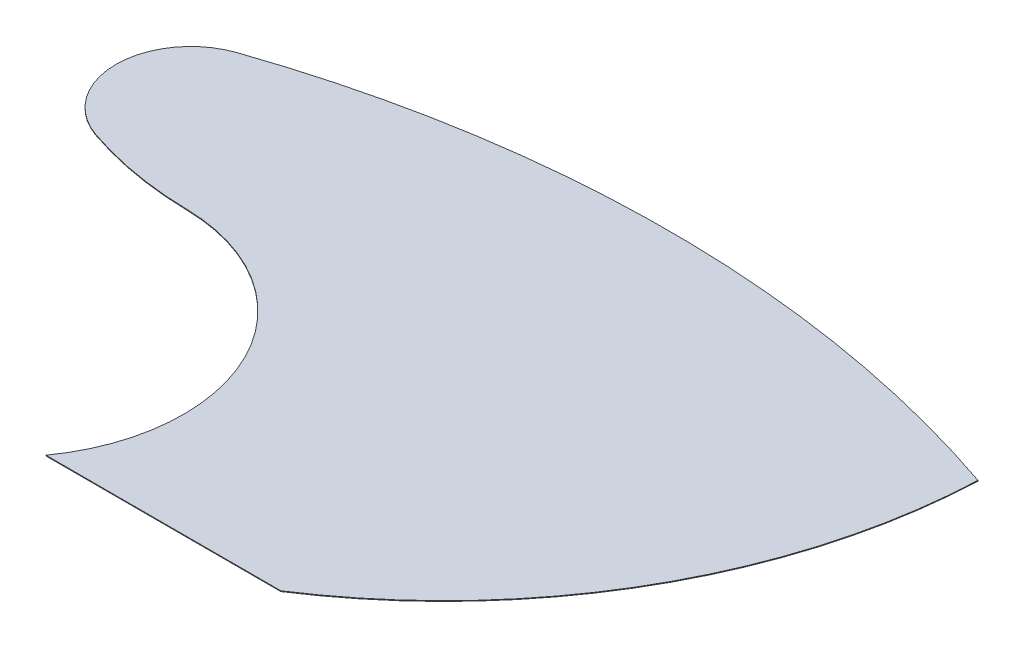
ISO-10303-21;
HEADER;
FILE_DESCRIPTION(('STEP AP214'),'2;1');
FILE_NAME('part.step','',(''),(''),'','','');
FILE_SCHEMA(('AUTOMOTIVE_DESIGN { 1 0 10303 214 1 1 1 1 }'));
ENDSEC;
DATA;
#1=APPLICATION_CONTEXT('core data for automotive mechanical design processes');
#2=APPLICATION_PROTOCOL_DEFINITION('international standard','automotive_design',2000,#1);
#3=PRODUCT_CONTEXT('',#1,'mechanical');
#4=PRODUCT('Part','Part','',(#3));
#5=PRODUCT_RELATED_PRODUCT_CATEGORY('part','',(#4));
#6=PRODUCT_DEFINITION_FORMATION('','',#4);
#7=PRODUCT_DEFINITION_CONTEXT('part definition',#1,'design');
#8=PRODUCT_DEFINITION('design','',#6,#7);
#9=PRODUCT_DEFINITION_SHAPE('','',#8);
#10=(LENGTH_UNIT() NAMED_UNIT(*) SI_UNIT(.MILLI.,.METRE.));
#11=(NAMED_UNIT(*) PLANE_ANGLE_UNIT() SI_UNIT($,.RADIAN.));
#12=(NAMED_UNIT(*) SI_UNIT($,.STERADIAN.) SOLID_ANGLE_UNIT());
#13=UNCERTAINTY_MEASURE_WITH_UNIT(LENGTH_MEASURE(1.E-05),#10,'distance_accuracy_value','');
#14=(GEOMETRIC_REPRESENTATION_CONTEXT(3) GLOBAL_UNCERTAINTY_ASSIGNED_CONTEXT((#13)) GLOBAL_UNIT_ASSIGNED_CONTEXT((#10,
#11,#12)) REPRESENTATION_CONTEXT('',''));
#15=CARTESIAN_POINT('',(0.,0.,0.));
#16=DIRECTION('',(0.,0.,1.));
#17=DIRECTION('',(1.,0.,0.));
#18=AXIS2_PLACEMENT_3D('',#15,#16,#17);
#19=CARTESIAN_POINT('',(36.6950206360601,0.2,-35.8213664681786));
#20=DIRECTION('',(0.,-1.,0.));
#21=DIRECTION('',(0.,0.,-1.));
#22=AXIS2_PLACEMENT_3D('',#19,#20,#21);
#23=CYLINDRICAL_SURFACE('',#22,49.58);
#24=CARTESIAN_POINT('',(36.6950206360601,0.,-35.8213664681786));
#25=DIRECTION('',(0.,-1.,0.));
#26=DIRECTION('',(0.,0.,1.));
#27=AXIS2_PLACEMENT_3D('',#24,#25,#26);
#28=CIRCLE('',#27,49.58);
#29=CARTESIAN_POINT('',(37.5541810671988,0.,-85.3939218123766));
#30=VERTEX_POINT('',#29);
#31=CARTESIAN_POINT('',(77.0118111562556,0.,-6.96425638850026));
#32=VERTEX_POINT('',#31);
#33=EDGE_CURVE('E117',#30,#32,#28,.T.);
#34=ORIENTED_EDGE('',*,*,#33,.T.);
#35=DIRECTION('',(0.,-1.,0.));
#36=VECTOR('',#35,1.);
#37=CARTESIAN_POINT('',(77.0118111562556,0.2,-6.96425638850026));
#38=LINE('',#37,#36);
#39=CARTESIAN_POINT('',(77.0118111562556,0.2,-6.96425638850026));
#40=VERTEX_POINT('',#39);
#41=EDGE_CURVE('E11',#40,#32,#38,.T.);
#42=ORIENTED_EDGE('',*,*,#41,.F.);
#43=CARTESIAN_POINT('',(36.6950206360601,0.2,-35.8213664681786));
#44=DIRECTION('',(0.,-1.,0.));
#45=DIRECTION('',(0.,0.,1.));
#46=AXIS2_PLACEMENT_3D('',#43,#44,#45);
#47=CIRCLE('',#46,49.58);
#48=CARTESIAN_POINT('',(37.5541810671988,0.2,-85.3939218123766));
#49=VERTEX_POINT('',#48);
#50=EDGE_CURVE('E127',#49,#40,#47,.T.);
#51=ORIENTED_EDGE('',*,*,#50,.F.);
#52=DIRECTION('',(0.,-1.,0.));
#53=VECTOR('',#52,1.);
#54=CARTESIAN_POINT('',(37.5541810671988,0.2,-85.3939218123766));
#55=LINE('',#54,#53);
#56=EDGE_CURVE('E113',#49,#30,#55,.T.);
#57=ORIENTED_EDGE('',*,*,#56,.T.);
#58=EDGE_LOOP('',(#34,#42,#51,#57));
#59=FACE_BOUND('',#58,.T.);
#60=ADVANCED_FACE('F33',(#59),#23,.F.);
#61=CARTESIAN_POINT('',(77.0118111562556,0.2,-6.96425638850026));
#62=DIRECTION('',(0.,0.,-1.));
#63=DIRECTION('',(-1.,0.,0.));
#64=AXIS2_PLACEMENT_3D('',#61,#62,#63);
#65=PLANE('',#64);
#66=DIRECTION('',(1.,0.,0.));
#67=VECTOR('',#66,1.);
#68=CARTESIAN_POINT('',(77.0118111562556,0.,-6.96425638850026));
#69=LINE('',#68,#67);
#70=CARTESIAN_POINT('',(142.011811156256,0.,-6.96425638850026));
#71=VERTEX_POINT('',#70);
#72=EDGE_CURVE('E120',#32,#71,#69,.T.);
#73=ORIENTED_EDGE('',*,*,#72,.T.);
#74=DIRECTION('',(0.,-1.,0.));
#75=VECTOR('',#74,1.);
#76=CARTESIAN_POINT('',(142.011811156256,0.2,-6.96425638850026));
#77=LINE('',#76,#75);
#78=CARTESIAN_POINT('',(142.011811156256,0.2,-6.96425638850026));
#79=VERTEX_POINT('',#78);
#80=EDGE_CURVE('E41',#79,#71,#77,.T.);
#81=ORIENTED_EDGE('',*,*,#80,.F.);
#82=DIRECTION('',(1.,0.,0.));
#83=VECTOR('',#82,1.);
#84=CARTESIAN_POINT('',(77.0118111562556,0.2,-6.96425638850026));
#85=LINE('',#84,#83);
#86=EDGE_CURVE('E86',#40,#79,#85,.T.);
#87=ORIENTED_EDGE('',*,*,#86,.F.);
#88=ORIENTED_EDGE('',*,*,#41,.T.);
#89=EDGE_LOOP('',(#73,#81,#87,#88));
#90=FACE_BOUND('',#89,.T.);
#91=ADVANCED_FACE('F151',(#90),#65,.F.);
#92=CARTESIAN_POINT('',(57.9997865278134,0.2,-136.197066919843));
#93=DIRECTION('',(0.,-1.,0.));
#94=DIRECTION('',(0.,0.,-1.));
#95=AXIS2_PLACEMENT_3D('',#92,#93,#94);
#96=CYLINDRICAL_SURFACE('',#95,154.14);
#97=CARTESIAN_POINT('',(57.9997865278134,0.,-136.197066919843));
#98=DIRECTION('',(0.,1.,0.));
#99=DIRECTION('',(0.,0.,1.));
#100=AXIS2_PLACEMENT_3D('',#97,#98,#99);
#101=CIRCLE('',#100,154.14);
#102=CARTESIAN_POINT('',(212.011811156256,0.,-129.91726836829));
#103=VERTEX_POINT('',#102);
#104=EDGE_CURVE('E122',#71,#103,#101,.T.);
#105=ORIENTED_EDGE('',*,*,#104,.T.);
#106=DIRECTION('',(0.,-1.,0.));
#107=VECTOR('',#106,1.);
#108=CARTESIAN_POINT('',(212.011811156256,0.2,-129.91726836829));
#109=LINE('',#108,#107);
#110=CARTESIAN_POINT('',(212.011811156256,0.2,-129.91726836829));
#111=VERTEX_POINT('',#110);
#112=EDGE_CURVE('E108',#111,#103,#109,.T.);
#113=ORIENTED_EDGE('',*,*,#112,.F.);
#114=CARTESIAN_POINT('',(57.9997865278134,0.2,-136.197066919843));
#115=DIRECTION('',(0.,1.,0.));
#116=DIRECTION('',(0.,0.,1.));
#117=AXIS2_PLACEMENT_3D('',#114,#115,#116);
#118=CIRCLE('',#117,154.14);
#119=EDGE_CURVE('E99',#79,#111,#118,.T.);
#120=ORIENTED_EDGE('',*,*,#119,.F.);
#121=ORIENTED_EDGE('',*,*,#80,.T.);
#122=EDGE_LOOP('',(#105,#113,#120,#121));
#123=FACE_BOUND('',#122,.T.);
#124=ADVANCED_FACE('F133',(#123),#96,.T.);
#125=CARTESIAN_POINT('',(109.511811156256,0.2,169.714848089111));
#126=DIRECTION('',(0.,-1.,0.));
#127=DIRECTION('',(0.,0.,-1.));
#128=AXIS2_PLACEMENT_3D('',#125,#126,#127);
#129=CYLINDRICAL_SURFACE('',#128,316.679104477611);
#130=CARTESIAN_POINT('',(109.511811156256,0.,169.714848089111));
#131=DIRECTION('',(0.,1.,0.));
#132=DIRECTION('',(0.,0.,-1.));
#133=AXIS2_PLACEMENT_3D('',#130,#131,#132);
#134=CIRCLE('',#133,316.679104477611);
#135=CARTESIAN_POINT('',(7.01181115625558,0.,-129.91726836829));
#136=VERTEX_POINT('',#135);
#137=EDGE_CURVE('E107',#103,#136,#134,.T.);
#138=ORIENTED_EDGE('',*,*,#137,.T.);
#139=DIRECTION('',(0.,-1.,0.));
#140=VECTOR('',#139,1.);
#141=CARTESIAN_POINT('',(7.01181115625558,0.2,-129.91726836829));
#142=LINE('',#141,#140);
#143=CARTESIAN_POINT('',(7.01181115625558,0.2,-129.91726836829));
#144=VERTEX_POINT('',#143);
#145=EDGE_CURVE('E104',#144,#136,#142,.T.);
#146=ORIENTED_EDGE('',*,*,#145,.F.);
#147=CARTESIAN_POINT('',(109.511811156256,0.2,169.714848089111));
#148=DIRECTION('',(0.,1.,0.));
#149=DIRECTION('',(0.,0.,-1.));
#150=AXIS2_PLACEMENT_3D('',#147,#148,#149);
#151=CIRCLE('',#150,316.679104477611);
#152=EDGE_CURVE('E93',#111,#144,#151,.T.);
#153=ORIENTED_EDGE('',*,*,#152,.F.);
#154=ORIENTED_EDGE('',*,*,#112,.T.);
#155=EDGE_LOOP('',(#138,#146,#153,#154));
#156=FACE_BOUND('',#155,.T.);
#157=ADVANCED_FACE('F105',(#156),#129,.T.);
#158=CARTESIAN_POINT('',(13.7118111562556,0.2,-110.331559292538));
#159=DIRECTION('',(0.,-1.,0.));
#160=DIRECTION('',(0.,0.,-1.));
#161=AXIS2_PLACEMENT_3D('',#158,#159,#160);
#162=CYLINDRICAL_SURFACE('',#161,20.7);
#163=CARTESIAN_POINT('',(13.7118111562556,0.,-110.331559292538));
#164=DIRECTION('',(0.,1.,0.));
#165=DIRECTION('',(0.,0.,1.));
#166=AXIS2_PLACEMENT_3D('',#163,#164,#165);
#167=CIRCLE('',#166,20.7);
#168=CARTESIAN_POINT('',(7.01181115625564,0.,-90.7458502167862));
#169=VERTEX_POINT('',#168);
#170=EDGE_CURVE('E72',#136,#169,#167,.T.);
#171=ORIENTED_EDGE('',*,*,#170,.T.);
#172=DIRECTION('',(0.,-1.,0.));
#173=VECTOR('',#172,1.);
#174=CARTESIAN_POINT('',(7.01181115625564,0.2,-90.7458502167862));
#175=LINE('',#174,#173);
#176=CARTESIAN_POINT('',(7.01181115625564,0.2,-90.7458502167862));
#177=VERTEX_POINT('',#176);
#178=EDGE_CURVE('E109',#177,#169,#175,.T.);
#179=ORIENTED_EDGE('',*,*,#178,.F.);
#180=CARTESIAN_POINT('',(13.7118111562556,0.2,-110.331559292538));
#181=DIRECTION('',(0.,1.,0.));
#182=DIRECTION('',(0.,0.,1.));
#183=AXIS2_PLACEMENT_3D('',#180,#181,#182);
#184=CIRCLE('',#183,20.7);
#185=EDGE_CURVE('E97',#144,#177,#184,.T.);
#186=ORIENTED_EDGE('',*,*,#185,.F.);
#187=ORIENTED_EDGE('',*,*,#145,.T.);
#188=EDGE_LOOP('',(#171,#179,#186,#187));
#189=FACE_BOUND('',#188,.T.);
#190=ADVANCED_FACE('F111',(#189),#162,.T.);
#191=CARTESIAN_POINT('',(39.2818594654344,0.2,-185.078951417389));
#192=DIRECTION('',(0.,-1.,0.));
#193=DIRECTION('',(0.,0.,-1.));
#194=AXIS2_PLACEMENT_3D('',#191,#192,#193);
#195=CYLINDRICAL_SURFACE('',#194,99.6999999999999);
#196=CARTESIAN_POINT('',(39.2818594654344,0.,-185.078951417389));
#197=DIRECTION('',(0.,1.,0.));
#198=DIRECTION('',(0.,0.,-1.));
#199=AXIS2_PLACEMENT_3D('',#196,#197,#198);
#200=CIRCLE('',#199,99.6999999999999);
#201=EDGE_CURVE('E78',#169,#30,#200,.T.);
#202=ORIENTED_EDGE('',*,*,#201,.T.);
#203=ORIENTED_EDGE('',*,*,#56,.F.);
#204=CARTESIAN_POINT('',(39.2818594654344,0.2,-185.078951417389));
#205=DIRECTION('',(0.,1.,0.));
#206=DIRECTION('',(0.,0.,-1.));
#207=AXIS2_PLACEMENT_3D('',#204,#205,#206);
#208=CIRCLE('',#207,99.6999999999999);
#209=EDGE_CURVE('E49',#177,#49,#208,.T.);
#210=ORIENTED_EDGE('',*,*,#209,.F.);
#211=ORIENTED_EDGE('',*,*,#178,.T.);
#212=EDGE_LOOP('',(#202,#203,#210,#211));
#213=FACE_BOUND('',#212,.T.);
#214=ADVANCED_FACE('F140',(#213),#195,.T.);
#215=CARTESIAN_POINT('',(36.6950206360601,0.2,-35.8213664681786));
#216=DIRECTION('',(0.,1.,0.));
#217=DIRECTION('',(0.,0.,1.));
#218=AXIS2_PLACEMENT_3D('',#215,#216,#217);
#219=PLANE('',#218);
#220=ORIENTED_EDGE('',*,*,#50,.T.);
#221=ORIENTED_EDGE('',*,*,#86,.T.);
#222=ORIENTED_EDGE('',*,*,#119,.T.);
#223=ORIENTED_EDGE('',*,*,#152,.T.);
#224=ORIENTED_EDGE('',*,*,#185,.T.);
#225=ORIENTED_EDGE('',*,*,#209,.T.);
#226=EDGE_LOOP('',(#220,#221,#222,#223,#224,#225));
#227=FACE_BOUND('',#226,.T.);
#228=ADVANCED_FACE('F95',(#227),#219,.T.);
#229=CARTESIAN_POINT('',(36.6950206360601,0.,-35.8213664681786));
#230=DIRECTION('',(0.,1.,0.));
#231=DIRECTION('',(0.,0.,1.));
#232=AXIS2_PLACEMENT_3D('',#229,#230,#231);
#233=PLANE('',#232);
#234=ORIENTED_EDGE('',*,*,#33,.F.);
#235=ORIENTED_EDGE('',*,*,#201,.F.);
#236=ORIENTED_EDGE('',*,*,#170,.F.);
#237=ORIENTED_EDGE('',*,*,#137,.F.);
#238=ORIENTED_EDGE('',*,*,#104,.F.);
#239=ORIENTED_EDGE('',*,*,#72,.F.);
#240=EDGE_LOOP('',(#234,#235,#236,#237,#238,#239));
#241=FACE_BOUND('',#240,.T.);
#242=ADVANCED_FACE('F136',(#241),#233,.F.);
#243=CLOSED_SHELL('',(#60,#91,#124,#157,#190,#214,#228,#242));
#244=MANIFOLD_SOLID_BREP('B2',#243);
#245=ADVANCED_BREP_SHAPE_REPRESENTATION('',(#18,#244),#14);
#246=SHAPE_DEFINITION_REPRESENTATION(#9,#245);
ENDSEC;
END-ISO-10303-21;
